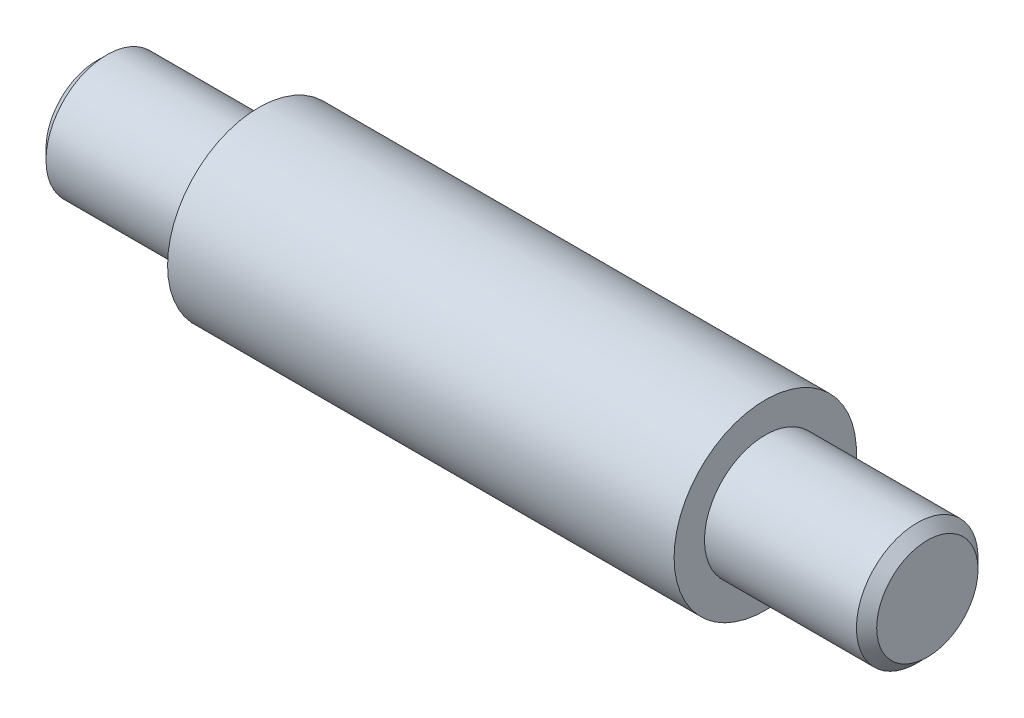
ISO-10303-21;
HEADER;
FILE_DESCRIPTION(('STEP AP214'),'2;1');
FILE_NAME('part.step','',(''),(''),'','','');
FILE_SCHEMA(('AUTOMOTIVE_DESIGN { 1 0 10303 214 1 1 1 1 }'));
ENDSEC;
DATA;
#1=APPLICATION_CONTEXT('core data for automotive mechanical design processes');
#2=APPLICATION_PROTOCOL_DEFINITION('international standard','automotive_design',2000,#1);
#3=PRODUCT_CONTEXT('',#1,'mechanical');
#4=PRODUCT('Part','Part','',(#3));
#5=PRODUCT_RELATED_PRODUCT_CATEGORY('part','',(#4));
#6=PRODUCT_DEFINITION_FORMATION('','',#4);
#7=PRODUCT_DEFINITION_CONTEXT('part definition',#1,'design');
#8=PRODUCT_DEFINITION('design','',#6,#7);
#9=PRODUCT_DEFINITION_SHAPE('','',#8);
#10=(LENGTH_UNIT() NAMED_UNIT(*) SI_UNIT(.MILLI.,.METRE.));
#11=(NAMED_UNIT(*) PLANE_ANGLE_UNIT() SI_UNIT($,.RADIAN.));
#12=(NAMED_UNIT(*) SI_UNIT($,.STERADIAN.) SOLID_ANGLE_UNIT());
#13=UNCERTAINTY_MEASURE_WITH_UNIT(LENGTH_MEASURE(1.E-05),#10,'distance_accuracy_value','');
#14=(GEOMETRIC_REPRESENTATION_CONTEXT(3) GLOBAL_UNCERTAINTY_ASSIGNED_CONTEXT((#13)) GLOBAL_UNIT_ASSIGNED_CONTEXT((#10,
#11,#12)) REPRESENTATION_CONTEXT('',''));
#15=CARTESIAN_POINT('',(0.,0.,0.));
#16=DIRECTION('',(0.,0.,1.));
#17=DIRECTION('',(1.,0.,0.));
#18=AXIS2_PLACEMENT_3D('',#15,#16,#17);
#19=CARTESIAN_POINT('',(0.,0.,0.));
#20=DIRECTION('',(-1.,0.,0.));
#21=DIRECTION('',(0.,0.,1.));
#22=AXIS2_PLACEMENT_3D('',#19,#20,#21);
#23=CYLINDRICAL_SURFACE('',#22,6.);
#24=CARTESIAN_POINT('',(25.,0.,0.));
#25=DIRECTION('',(-1.,0.,0.));
#26=DIRECTION('',(0.,0.,1.));
#27=AXIS2_PLACEMENT_3D('',#24,#25,#26);
#28=CIRCLE('',#27,6.);
#29=CARTESIAN_POINT('',(25.,0.,6.));
#30=VERTEX_POINT('',#29);
#31=EDGE_CURVE('E72',#30,#30,#28,.T.);
#32=ORIENTED_EDGE('',*,*,#31,.F.);
#33=EDGE_LOOP('',(#32));
#34=FACE_BOUND('',#33,.T.);
#35=CARTESIAN_POINT('',(40.,0.,0.));
#36=DIRECTION('',(-1.,0.,0.));
#37=DIRECTION('',(0.,0.,1.));
#38=AXIS2_PLACEMENT_3D('',#35,#36,#37);
#39=CIRCLE('',#38,6.);
#40=CARTESIAN_POINT('',(40.,0.,6.));
#41=VERTEX_POINT('',#40);
#42=EDGE_CURVE('E10',#41,#41,#39,.T.);
#43=ORIENTED_EDGE('',*,*,#42,.T.);
#44=EDGE_LOOP('',(#43));
#45=FACE_BOUND('',#44,.T.);
#46=ADVANCED_FACE('F37',(#34,#45),#23,.T.);
#47=CARTESIAN_POINT('',(40.9999999999997,0.,0.));
#48=DIRECTION('',(-1.,0.,0.));
#49=DIRECTION('',(0.,0.,1.));
#50=AXIS2_PLACEMENT_3D('',#47,#48,#49);
#51=CONICAL_SURFACE('',#50,5.,0.78539816339758);
#52=ORIENTED_EDGE('',*,*,#42,.F.);
#53=EDGE_LOOP('',(#52));
#54=FACE_BOUND('',#53,.T.);
#55=CARTESIAN_POINT('',(40.9999999999997,0.,0.));
#56=DIRECTION('',(-1.,0.,0.));
#57=DIRECTION('',(0.,0.,1.));
#58=AXIS2_PLACEMENT_3D('',#55,#56,#57);
#59=CIRCLE('',#58,5.);
#60=CARTESIAN_POINT('',(40.9999999999997,0.,5.));
#61=VERTEX_POINT('',#60);
#62=EDGE_CURVE('E44',#61,#61,#59,.T.);
#63=ORIENTED_EDGE('',*,*,#62,.T.);
#64=EDGE_LOOP('',(#63));
#65=FACE_BOUND('',#64,.T.);
#66=ADVANCED_FACE('F80',(#54,#65),#51,.T.);
#67=CARTESIAN_POINT('',(40.9999999999991,5.,0.));
#68=DIRECTION('',(-1.,0.,0.));
#69=DIRECTION('',(0.,0.,1.));
#70=AXIS2_PLACEMENT_3D('',#67,#68,#69);
#71=PLANE('',#70);
#72=ORIENTED_EDGE('',*,*,#62,.F.);
#73=EDGE_LOOP('',(#72));
#74=FACE_BOUND('',#73,.T.);
#75=ADVANCED_FACE('F84',(#74),#71,.F.);
#76=CARTESIAN_POINT('',(-40.9999999999995,5.,0.));
#77=DIRECTION('',(1.,0.,0.));
#78=DIRECTION('',(0.,0.,-1.));
#79=AXIS2_PLACEMENT_3D('',#76,#77,#78);
#80=PLANE('',#79);
#81=CARTESIAN_POINT('',(-40.9999999999997,0.,0.));
#82=DIRECTION('',(-1.,0.,0.));
#83=DIRECTION('',(0.,0.,1.));
#84=AXIS2_PLACEMENT_3D('',#81,#82,#83);
#85=CIRCLE('',#84,5.);
#86=CARTESIAN_POINT('',(-40.9999999999997,0.,5.));
#87=VERTEX_POINT('',#86);
#88=EDGE_CURVE('E49',#87,#87,#85,.T.);
#89=ORIENTED_EDGE('',*,*,#88,.T.);
#90=EDGE_LOOP('',(#89));
#91=FACE_BOUND('',#90,.T.);
#92=ADVANCED_FACE('F89',(#91),#80,.F.);
#93=CARTESIAN_POINT('',(-40.,0.,0.));
#94=DIRECTION('',(1.,0.,0.));
#95=DIRECTION('',(0.,0.,-1.));
#96=AXIS2_PLACEMENT_3D('',#93,#94,#95);
#97=CONICAL_SURFACE('',#96,6.,0.78539816339758);
#98=ORIENTED_EDGE('',*,*,#88,.F.);
#99=EDGE_LOOP('',(#98));
#100=FACE_BOUND('',#99,.T.);
#101=CARTESIAN_POINT('',(-40.,0.,0.));
#102=DIRECTION('',(-1.,0.,0.));
#103=DIRECTION('',(0.,0.,1.));
#104=AXIS2_PLACEMENT_3D('',#101,#102,#103);
#105=CIRCLE('',#104,6.);
#106=CARTESIAN_POINT('',(-40.,0.,6.));
#107=VERTEX_POINT('',#106);
#108=EDGE_CURVE('E54',#107,#107,#105,.T.);
#109=ORIENTED_EDGE('',*,*,#108,.T.);
#110=EDGE_LOOP('',(#109));
#111=FACE_BOUND('',#110,.T.);
#112=ADVANCED_FACE('F95',(#100,#111),#97,.T.);
#113=CARTESIAN_POINT('',(0.,0.,0.));
#114=DIRECTION('',(-1.,0.,0.));
#115=DIRECTION('',(0.,0.,1.));
#116=AXIS2_PLACEMENT_3D('',#113,#114,#115);
#117=CYLINDRICAL_SURFACE('',#116,5.99999999999902);
#118=ORIENTED_EDGE('',*,*,#108,.F.);
#119=EDGE_LOOP('',(#118));
#120=FACE_BOUND('',#119,.T.);
#121=CARTESIAN_POINT('',(-25.,0.,0.));
#122=DIRECTION('',(-1.,0.,0.));
#123=DIRECTION('',(0.,0.,1.));
#124=AXIS2_PLACEMENT_3D('',#121,#122,#123);
#125=CIRCLE('',#124,5.99999999999803);
#126=CARTESIAN_POINT('',(-25.,0.,5.99999999999803));
#127=VERTEX_POINT('',#126);
#128=EDGE_CURVE('E60',#127,#127,#125,.T.);
#129=ORIENTED_EDGE('',*,*,#128,.T.);
#130=EDGE_LOOP('',(#129));
#131=FACE_BOUND('',#130,.T.);
#132=ADVANCED_FACE('F99',(#120,#131),#117,.T.);
#133=CARTESIAN_POINT('',(-24.9999999999998,9.,0.));
#134=DIRECTION('',(1.,0.,0.));
#135=DIRECTION('',(0.,0.,-1.));
#136=AXIS2_PLACEMENT_3D('',#133,#134,#135);
#137=PLANE('',#136);
#138=ORIENTED_EDGE('',*,*,#128,.F.);
#139=EDGE_LOOP('',(#138));
#140=FACE_BOUND('',#139,.T.);
#141=CARTESIAN_POINT('',(-24.9999999999996,0.,0.));
#142=DIRECTION('',(-1.,0.,0.));
#143=DIRECTION('',(0.,0.,1.));
#144=AXIS2_PLACEMENT_3D('',#141,#142,#143);
#145=CIRCLE('',#144,9.);
#146=CARTESIAN_POINT('',(-24.9999999999996,0.,9.));
#147=VERTEX_POINT('',#146);
#148=EDGE_CURVE('E64',#147,#147,#145,.T.);
#149=ORIENTED_EDGE('',*,*,#148,.T.);
#150=EDGE_LOOP('',(#149));
#151=FACE_BOUND('',#150,.T.);
#152=ADVANCED_FACE('F103',(#140,#151),#137,.F.);
#153=CARTESIAN_POINT('',(0.,0.,0.));
#154=DIRECTION('',(-1.,0.,0.));
#155=DIRECTION('',(0.,0.,1.));
#156=AXIS2_PLACEMENT_3D('',#153,#154,#155);
#157=CYLINDRICAL_SURFACE('',#156,9.);
#158=ORIENTED_EDGE('',*,*,#148,.F.);
#159=EDGE_LOOP('',(#158));
#160=FACE_BOUND('',#159,.T.);
#161=CARTESIAN_POINT('',(25.,0.,0.));
#162=DIRECTION('',(-1.,0.,0.));
#163=DIRECTION('',(0.,0.,1.));
#164=AXIS2_PLACEMENT_3D('',#161,#162,#163);
#165=CIRCLE('',#164,9.);
#166=CARTESIAN_POINT('',(25.,0.,9.));
#167=VERTEX_POINT('',#166);
#168=EDGE_CURVE('E68',#167,#167,#165,.T.);
#169=ORIENTED_EDGE('',*,*,#168,.T.);
#170=EDGE_LOOP('',(#169));
#171=FACE_BOUND('',#170,.T.);
#172=ADVANCED_FACE('F107',(#160,#171),#157,.T.);
#173=CARTESIAN_POINT('',(25.,9.,0.));
#174=DIRECTION('',(-1.,0.,0.));
#175=DIRECTION('',(0.,0.,1.));
#176=AXIS2_PLACEMENT_3D('',#173,#174,#175);
#177=PLANE('',#176);
#178=ORIENTED_EDGE('',*,*,#168,.F.);
#179=EDGE_LOOP('',(#178));
#180=FACE_BOUND('',#179,.T.);
#181=ORIENTED_EDGE('',*,*,#31,.T.);
#182=EDGE_LOOP('',(#181));
#183=FACE_BOUND('',#182,.T.);
#184=ADVANCED_FACE('F77',(#180,#183),#177,.F.);
#185=CLOSED_SHELL('',(#46,#66,#75,#92,#112,#132,#152,#172,#184));
#186=MANIFOLD_SOLID_BREP('B2',#185);
#187=ADVANCED_BREP_SHAPE_REPRESENTATION('',(#18,#186),#14);
#188=SHAPE_DEFINITION_REPRESENTATION(#9,#187);
ENDSEC;
END-ISO-10303-21;
